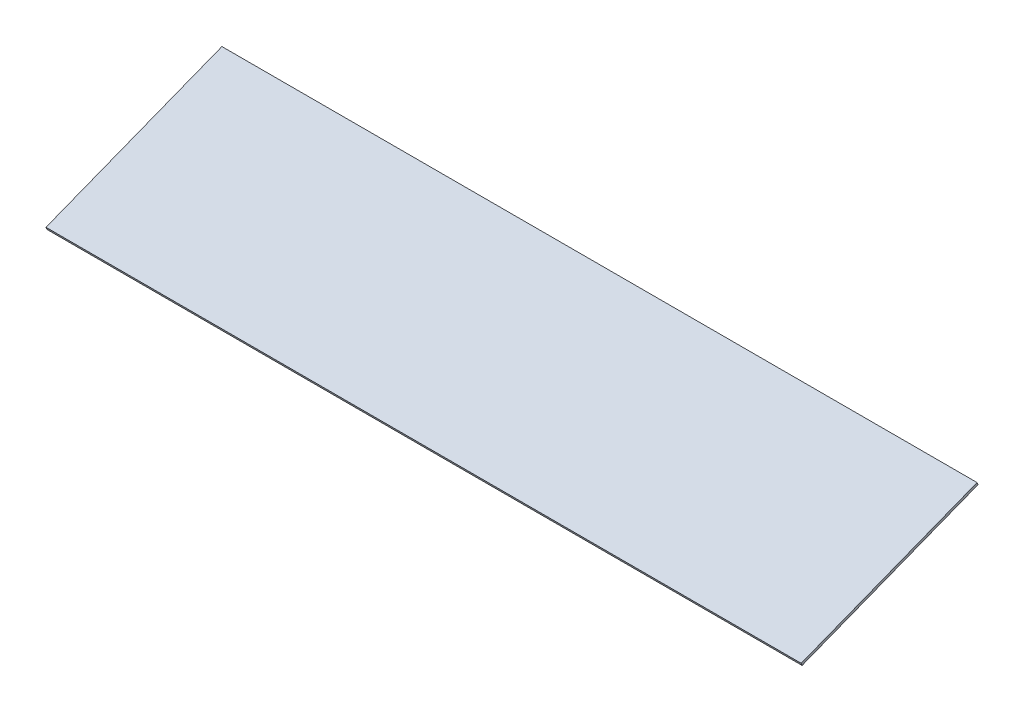
ISO-10303-21;
HEADER;
FILE_DESCRIPTION(('STEP AP214'),'2;1');
FILE_NAME('part.step','',(''),(''),'','','');
FILE_SCHEMA(('AUTOMOTIVE_DESIGN { 1 0 10303 214 1 1 1 1 }'));
ENDSEC;
DATA;
#1=APPLICATION_CONTEXT('core data for automotive mechanical design processes');
#2=APPLICATION_PROTOCOL_DEFINITION('international standard','automotive_design',2000,#1);
#3=PRODUCT_CONTEXT('',#1,'mechanical');
#4=PRODUCT('Part','Part','',(#3));
#5=PRODUCT_RELATED_PRODUCT_CATEGORY('part','',(#4));
#6=PRODUCT_DEFINITION_FORMATION('','',#4);
#7=PRODUCT_DEFINITION_CONTEXT('part definition',#1,'design');
#8=PRODUCT_DEFINITION('design','',#6,#7);
#9=PRODUCT_DEFINITION_SHAPE('','',#8);
#10=(LENGTH_UNIT() NAMED_UNIT(*) SI_UNIT(.MILLI.,.METRE.));
#11=(NAMED_UNIT(*) PLANE_ANGLE_UNIT() SI_UNIT($,.RADIAN.));
#12=(NAMED_UNIT(*) SI_UNIT($,.STERADIAN.) SOLID_ANGLE_UNIT());
#13=UNCERTAINTY_MEASURE_WITH_UNIT(LENGTH_MEASURE(1.E-05),#10,'distance_accuracy_value','');
#14=(GEOMETRIC_REPRESENTATION_CONTEXT(3) GLOBAL_UNCERTAINTY_ASSIGNED_CONTEXT((#13)) GLOBAL_UNIT_ASSIGNED_CONTEXT((#10,
#11,#12)) REPRESENTATION_CONTEXT('',''));
#15=CARTESIAN_POINT('',(0.,0.,0.));
#16=DIRECTION('',(0.,0.,1.));
#17=DIRECTION('',(1.,0.,0.));
#18=AXIS2_PLACEMENT_3D('',#15,#16,#17);
#19=CARTESIAN_POINT('',(0.,-4.10085933707645,-13.3800919252697));
#20=DIRECTION('',(-1.,0.,0.));
#21=DIRECTION('',(0.,0.363149924629456,-0.931730718738853));
#22=AXIS2_PLACEMENT_3D('',#19,#20,#21);
#23=PLANE('',#22);
#24=DIRECTION('',(0.,-0.931730718738853,-0.363149924629456));
#25=VECTOR('',#24,1.);
#26=CARTESIAN_POINT('',(0.,-4.10085933707645,-13.3800919252697));
#27=LINE('',#26,#25);
#28=CARTESIAN_POINT('',(0.,-4.00768626520256,-13.3437769328068));
#29=VERTEX_POINT('',#28);
#30=CARTESIAN_POINT('',(0.,-4.10085933707645,-13.3800919252697));
#31=VERTEX_POINT('',#30);
#32=EDGE_CURVE('E11',#29,#31,#27,.T.);
#33=ORIENTED_EDGE('',*,*,#32,.F.);
#34=DIRECTION('',(0.,0.363149924629456,-0.931730718738853));
#35=VECTOR('',#34,1.);
#36=CARTESIAN_POINT('',(0.,-4.00768626520256,-13.3437769328068));
#37=LINE('',#36,#35);
#38=CARTESIAN_POINT('',(0.,-1.28406183048164,-20.3317573233482));
#39=VERTEX_POINT('',#38);
#40=EDGE_CURVE('E88',#29,#39,#37,.T.);
#41=ORIENTED_EDGE('',*,*,#40,.T.);
#42=DIRECTION('',(0.,-0.931730718738853,-0.363149924629456));
#43=VECTOR('',#42,1.);
#44=CARTESIAN_POINT('',(0.,-1.37723490235553,-20.3680723158111));
#45=LINE('',#44,#43);
#46=CARTESIAN_POINT('',(0.,-1.37723490235553,-20.3680723158111));
#47=VERTEX_POINT('',#46);
#48=EDGE_CURVE('E43',#39,#47,#45,.T.);
#49=ORIENTED_EDGE('',*,*,#48,.T.);
#50=DIRECTION('',(0.,0.363149924629456,-0.931730718738853));
#51=VECTOR('',#50,1.);
#52=CARTESIAN_POINT('',(0.,-4.10085933707645,-13.3800919252697));
#53=LINE('',#52,#51);
#54=EDGE_CURVE('E101',#31,#47,#53,.T.);
#55=ORIENTED_EDGE('',*,*,#54,.F.);
#56=EDGE_LOOP('',(#33,#41,#49,#55));
#57=FACE_BOUND('',#56,.T.);
#58=ADVANCED_FACE('F33',(#57),#23,.T.);
#59=CARTESIAN_POINT('',(0.,-1.37723490235553,-20.3680723158111));
#60=DIRECTION('',(0.,0.363149924629456,-0.931730718738853));
#61=DIRECTION('',(1.,0.,0.));
#62=AXIS2_PLACEMENT_3D('',#59,#60,#61);
#63=PLANE('',#62);
#64=ORIENTED_EDGE('',*,*,#48,.F.);
#65=DIRECTION('',(1.,0.,0.));
#66=VECTOR('',#65,1.);
#67=CARTESIAN_POINT('',(0.,-1.28406183048164,-20.3317573233482));
#68=LINE('',#67,#66);
#69=CARTESIAN_POINT('',(30.,-1.28406183048164,-20.3317573233482));
#70=VERTEX_POINT('',#69);
#71=EDGE_CURVE('E95',#39,#70,#68,.T.);
#72=ORIENTED_EDGE('',*,*,#71,.T.);
#73=DIRECTION('',(0.,-0.931730718738853,-0.363149924629456));
#74=VECTOR('',#73,1.);
#75=CARTESIAN_POINT('',(30.,-1.37723490235553,-20.3680723158111));
#76=LINE('',#75,#74);
#77=CARTESIAN_POINT('',(30.,-1.37723490235553,-20.3680723158111));
#78=VERTEX_POINT('',#77);
#79=EDGE_CURVE('E51',#70,#78,#76,.T.);
#80=ORIENTED_EDGE('',*,*,#79,.T.);
#81=DIRECTION('',(1.,0.,0.));
#82=VECTOR('',#81,1.);
#83=CARTESIAN_POINT('',(0.,-1.37723490235553,-20.3680723158111));
#84=LINE('',#83,#82);
#85=EDGE_CURVE('E82',#47,#78,#84,.T.);
#86=ORIENTED_EDGE('',*,*,#85,.F.);
#87=EDGE_LOOP('',(#64,#72,#80,#86));
#88=FACE_BOUND('',#87,.T.);
#89=ADVANCED_FACE('F105',(#88),#63,.T.);
#90=CARTESIAN_POINT('',(30.,-4.10085933707645,-13.3800919252697));
#91=DIRECTION('',(-1.,0.,0.));
#92=DIRECTION('',(0.,0.363149924629456,-0.931730718738853));
#93=AXIS2_PLACEMENT_3D('',#90,#91,#92);
#94=PLANE('',#93);
#95=ORIENTED_EDGE('',*,*,#79,.F.);
#96=DIRECTION('',(0.,0.363149924629456,-0.931730718738853));
#97=VECTOR('',#96,1.);
#98=CARTESIAN_POINT('',(30.,-4.00768626520256,-13.3437769328068));
#99=LINE('',#98,#97);
#100=CARTESIAN_POINT('',(30.,-4.00768626520256,-13.3437769328068));
#101=VERTEX_POINT('',#100);
#102=EDGE_CURVE('E87',#101,#70,#99,.T.);
#103=ORIENTED_EDGE('',*,*,#102,.F.);
#104=DIRECTION('',(0.,-0.931730718738853,-0.363149924629456));
#105=VECTOR('',#104,1.);
#106=CARTESIAN_POINT('',(30.,-4.10085933707645,-13.3800919252697));
#107=LINE('',#106,#105);
#108=CARTESIAN_POINT('',(30.,-4.10085933707645,-13.3800919252697));
#109=VERTEX_POINT('',#108);
#110=EDGE_CURVE('E37',#101,#109,#107,.T.);
#111=ORIENTED_EDGE('',*,*,#110,.T.);
#112=DIRECTION('',(0.,0.363149924629456,-0.931730718738853));
#113=VECTOR('',#112,1.);
#114=CARTESIAN_POINT('',(30.,-4.10085933707645,-13.3800919252697));
#115=LINE('',#114,#113);
#116=EDGE_CURVE('E97',#109,#78,#115,.T.);
#117=ORIENTED_EDGE('',*,*,#116,.T.);
#118=EDGE_LOOP('',(#95,#103,#111,#117));
#119=FACE_BOUND('',#118,.T.);
#120=ADVANCED_FACE('F90',(#119),#94,.F.);
#121=CARTESIAN_POINT('',(0.,-4.10085933707645,-13.3800919252697));
#122=DIRECTION('',(0.,0.363149924629456,-0.931730718738853));
#123=DIRECTION('',(1.,0.,0.));
#124=AXIS2_PLACEMENT_3D('',#121,#122,#123);
#125=PLANE('',#124);
#126=DIRECTION('',(1.,0.,0.));
#127=VECTOR('',#126,1.);
#128=CARTESIAN_POINT('',(0.,-4.00768626520256,-13.3437769328068));
#129=LINE('',#128,#127);
#130=EDGE_CURVE('E76',#29,#101,#129,.T.);
#131=ORIENTED_EDGE('',*,*,#130,.F.);
#132=ORIENTED_EDGE('',*,*,#32,.T.);
#133=DIRECTION('',(1.,0.,0.));
#134=VECTOR('',#133,1.);
#135=CARTESIAN_POINT('',(0.,-4.10085933707645,-13.3800919252697));
#136=LINE('',#135,#134);
#137=EDGE_CURVE('E78',#31,#109,#136,.T.);
#138=ORIENTED_EDGE('',*,*,#137,.T.);
#139=ORIENTED_EDGE('',*,*,#110,.F.);
#140=EDGE_LOOP('',(#131,#132,#138,#139));
#141=FACE_BOUND('',#140,.T.);
#142=ADVANCED_FACE('F35',(#141),#125,.F.);
#143=CARTESIAN_POINT('',(0.,-4.10085933707645,-13.3800919252697));
#144=DIRECTION('',(0.,-0.931730718738853,-0.363149924629456));
#145=DIRECTION('',(0.,0.363149924629456,-0.931730718738853));
#146=AXIS2_PLACEMENT_3D('',#143,#144,#145);
#147=PLANE('',#146);
#148=ORIENTED_EDGE('',*,*,#116,.F.);
#149=ORIENTED_EDGE('',*,*,#137,.F.);
#150=ORIENTED_EDGE('',*,*,#54,.T.);
#151=ORIENTED_EDGE('',*,*,#85,.T.);
#152=EDGE_LOOP('',(#148,#149,#150,#151));
#153=FACE_BOUND('',#152,.T.);
#154=ADVANCED_FACE('F104',(#153),#147,.T.);
#155=CARTESIAN_POINT('',(0.,-4.00768626520256,-13.3437769328068));
#156=DIRECTION('',(0.,-0.931730718738853,-0.363149924629456));
#157=DIRECTION('',(0.,0.363149924629456,-0.931730718738853));
#158=AXIS2_PLACEMENT_3D('',#155,#156,#157);
#159=PLANE('',#158);
#160=ORIENTED_EDGE('',*,*,#102,.T.);
#161=ORIENTED_EDGE('',*,*,#71,.F.);
#162=ORIENTED_EDGE('',*,*,#40,.F.);
#163=ORIENTED_EDGE('',*,*,#130,.T.);
#164=EDGE_LOOP('',(#160,#161,#162,#163));
#165=FACE_BOUND('',#164,.T.);
#166=ADVANCED_FACE('F85',(#165),#159,.F.);
#167=CLOSED_SHELL('',(#58,#89,#120,#142,#154,#166));
#168=MANIFOLD_SOLID_BREP('B2',#167);
#169=ADVANCED_BREP_SHAPE_REPRESENTATION('',(#18,#168),#14);
#170=SHAPE_DEFINITION_REPRESENTATION(#9,#169);
ENDSEC;
END-ISO-10303-21;
